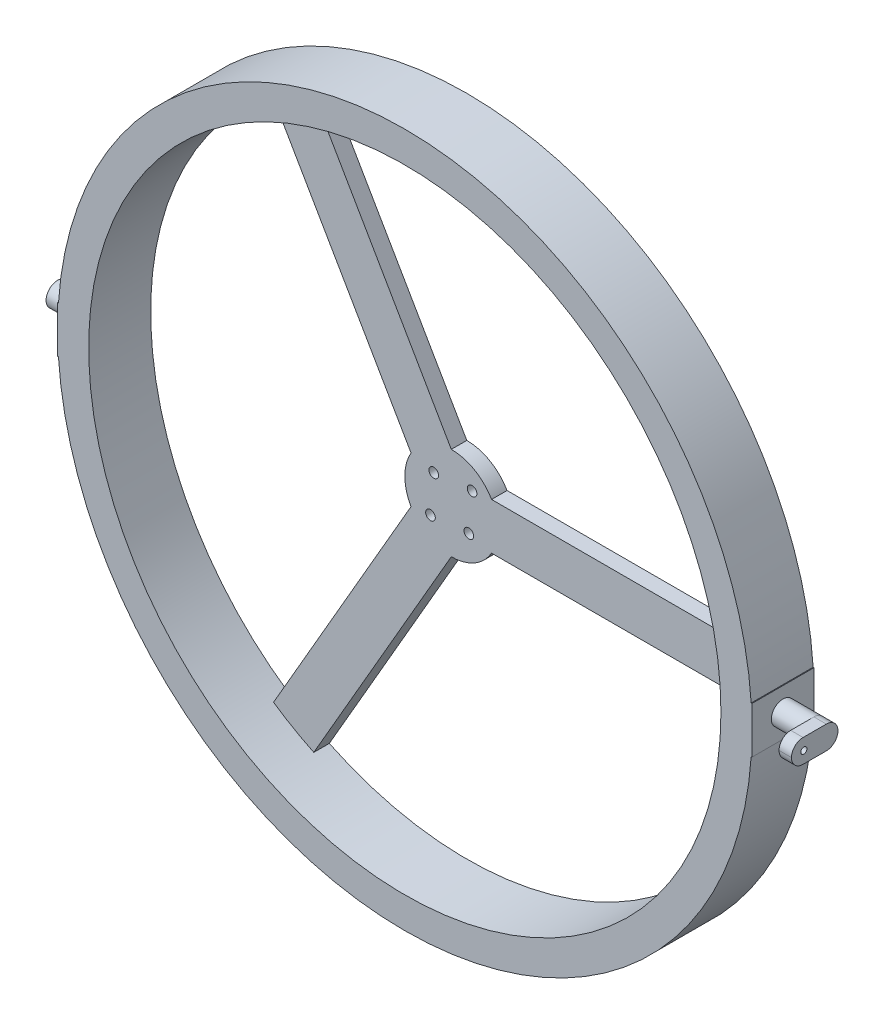
ISO-10303-21;
HEADER;
FILE_DESCRIPTION(('STEP AP214'),'2;1');
FILE_NAME('part.step','',(''),(''),'','','');
FILE_SCHEMA(('AUTOMOTIVE_DESIGN { 1 0 10303 214 1 1 1 1 }'));
ENDSEC;
DATA;
#1=APPLICATION_CONTEXT('core data for automotive mechanical design processes');
#2=APPLICATION_PROTOCOL_DEFINITION('international standard','automotive_design',2000,#1);
#3=PRODUCT_CONTEXT('',#1,'mechanical');
#4=PRODUCT('Part','Part','',(#3));
#5=PRODUCT_RELATED_PRODUCT_CATEGORY('part','',(#4));
#6=PRODUCT_DEFINITION_FORMATION('','',#4);
#7=PRODUCT_DEFINITION_CONTEXT('part definition',#1,'design');
#8=PRODUCT_DEFINITION('design','',#6,#7);
#9=PRODUCT_DEFINITION_SHAPE('','',#8);
#10=(LENGTH_UNIT() NAMED_UNIT(*) SI_UNIT(.MILLI.,.METRE.));
#11=(NAMED_UNIT(*) PLANE_ANGLE_UNIT() SI_UNIT($,.RADIAN.));
#12=(NAMED_UNIT(*) SI_UNIT($,.STERADIAN.) SOLID_ANGLE_UNIT());
#13=UNCERTAINTY_MEASURE_WITH_UNIT(LENGTH_MEASURE(1.E-05),#10,'distance_accuracy_value','');
#14=(GEOMETRIC_REPRESENTATION_CONTEXT(3) GLOBAL_UNCERTAINTY_ASSIGNED_CONTEXT((#13)) GLOBAL_UNIT_ASSIGNED_CONTEXT((#10,
#11,#12)) REPRESENTATION_CONTEXT('',''));
#15=CARTESIAN_POINT('',(0.,0.,0.));
#16=DIRECTION('',(0.,0.,1.));
#17=DIRECTION('',(1.,0.,0.));
#18=AXIS2_PLACEMENT_3D('',#15,#16,#17);
#19=CARTESIAN_POINT('',(112.,0.,20.));
#20=DIRECTION('',(1.,0.,0.));
#21=DIRECTION('',(0.,0.,-1.));
#22=AXIS2_PLACEMENT_3D('',#19,#20,#21);
#23=PLANE('',#22);
#24=DIRECTION('',(0.,-1.,0.));
#25=VECTOR('',#24,1.);
#26=CARTESIAN_POINT('',(112.,0.,0.));
#27=LINE('',#26,#25);
#28=CARTESIAN_POINT('',(112.,7.5,0.));
#29=VERTEX_POINT('',#28);
#30=CARTESIAN_POINT('',(112.,-7.5,0.));
#31=VERTEX_POINT('',#30);
#32=EDGE_CURVE('E391',#29,#31,#27,.T.);
#33=ORIENTED_EDGE('',*,*,#32,.F.);
#34=DIRECTION('',(0.,0.,-1.));
#35=VECTOR('',#34,1.);
#36=CARTESIAN_POINT('',(112.,7.5,20.));
#37=LINE('',#36,#35);
#38=CARTESIAN_POINT('',(112.,7.5,20.));
#39=VERTEX_POINT('',#38);
#40=EDGE_CURVE('E417',#39,#29,#37,.T.);
#41=ORIENTED_EDGE('',*,*,#40,.F.);
#42=DIRECTION('',(0.,-1.,0.));
#43=VECTOR('',#42,1.);
#44=CARTESIAN_POINT('',(112.,0.,20.));
#45=LINE('',#44,#43);
#46=CARTESIAN_POINT('',(112.,-7.5,20.));
#47=VERTEX_POINT('',#46);
#48=EDGE_CURVE('E367',#39,#47,#45,.T.);
#49=ORIENTED_EDGE('',*,*,#48,.T.);
#50=DIRECTION('',(0.,0.,-1.));
#51=VECTOR('',#50,1.);
#52=CARTESIAN_POINT('',(112.,-7.5,20.));
#53=LINE('',#52,#51);
#54=EDGE_CURVE('E419',#47,#31,#53,.T.);
#55=ORIENTED_EDGE('',*,*,#54,.T.);
#56=EDGE_LOOP('',(#33,#41,#49,#55));
#57=FACE_BOUND('',#56,.T.);
#58=CARTESIAN_POINT('',(112.,0.,10.));
#59=DIRECTION('',(1.,0.,0.));
#60=DIRECTION('',(0.,0.,-1.));
#61=AXIS2_PLACEMENT_3D('',#58,#59,#60);
#62=CIRCLE('',#61,3.75);
#63=CARTESIAN_POINT('',(112.,0.,6.25));
#64=VERTEX_POINT('',#63);
#65=EDGE_CURVE('E232',#64,#64,#62,.T.);
#66=ORIENTED_EDGE('',*,*,#65,.F.);
#67=EDGE_LOOP('',(#66));
#68=FACE_BOUND('',#67,.T.);
#69=ADVANCED_FACE('F37',(#57,#68),#23,.T.);
#70=CARTESIAN_POINT('',(-112.,0.,20.));
#71=DIRECTION('',(1.,0.,0.));
#72=DIRECTION('',(0.,0.,-1.));
#73=AXIS2_PLACEMENT_3D('',#70,#71,#72);
#74=PLANE('',#73);
#75=DIRECTION('',(0.,-1.,0.));
#76=VECTOR('',#75,1.);
#77=CARTESIAN_POINT('',(-112.,0.,0.));
#78=LINE('',#77,#76);
#79=CARTESIAN_POINT('',(-112.,7.5,0.));
#80=VERTEX_POINT('',#79);
#81=CARTESIAN_POINT('',(-112.,-7.50000000000001,0.));
#82=VERTEX_POINT('',#81);
#83=EDGE_CURVE('E401',#80,#82,#78,.T.);
#84=ORIENTED_EDGE('',*,*,#83,.T.);
#85=DIRECTION('',(0.,0.,-1.));
#86=VECTOR('',#85,1.);
#87=CARTESIAN_POINT('',(-112.,-7.50000000000001,20.));
#88=LINE('',#87,#86);
#89=CARTESIAN_POINT('',(-112.,-7.50000000000001,20.));
#90=VERTEX_POINT('',#89);
#91=EDGE_CURVE('E382',#90,#82,#88,.T.);
#92=ORIENTED_EDGE('',*,*,#91,.F.);
#93=DIRECTION('',(0.,-1.,0.));
#94=VECTOR('',#93,1.);
#95=CARTESIAN_POINT('',(-112.,0.,20.));
#96=LINE('',#95,#94);
#97=CARTESIAN_POINT('',(-112.,7.5,20.));
#98=VERTEX_POINT('',#97);
#99=EDGE_CURVE('E377',#98,#90,#96,.T.);
#100=ORIENTED_EDGE('',*,*,#99,.F.);
#101=DIRECTION('',(0.,0.,-1.));
#102=VECTOR('',#101,1.);
#103=CARTESIAN_POINT('',(-112.,7.5,20.));
#104=LINE('',#103,#102);
#105=EDGE_CURVE('E409',#98,#80,#104,.T.);
#106=ORIENTED_EDGE('',*,*,#105,.T.);
#107=EDGE_LOOP('',(#84,#92,#100,#106));
#108=FACE_BOUND('',#107,.T.);
#109=CARTESIAN_POINT('',(-112.,0.,10.));
#110=DIRECTION('',(1.,0.,0.));
#111=DIRECTION('',(0.,0.,-1.));
#112=AXIS2_PLACEMENT_3D('',#109,#110,#111);
#113=CIRCLE('',#112,3.75);
#114=CARTESIAN_POINT('',(-112.,0.,6.25));
#115=VERTEX_POINT('',#114);
#116=EDGE_CURVE('E426',#115,#115,#113,.F.);
#117=ORIENTED_EDGE('',*,*,#116,.F.);
#118=EDGE_LOOP('',(#117));
#119=FACE_BOUND('',#118,.T.);
#120=ADVANCED_FACE('F470',(#108,#119),#74,.F.);
#121=CARTESIAN_POINT('',(0.,0.,20.));
#122=DIRECTION('',(0.,0.,-1.));
#123=DIRECTION('',(-1.,0.,0.));
#124=AXIS2_PLACEMENT_3D('',#121,#122,#123);
#125=CYLINDRICAL_SURFACE('',#124,102.);
#126=DIRECTION('',(0.,0.,-1.));
#127=VECTOR('',#126,1.);
#128=CARTESIAN_POINT('',(-57.3571360279416,84.3454737770332,5.));
#129=LINE('',#128,#127);
#130=CARTESIAN_POINT('',(-57.3571360279416,84.3454737770332,5.));
#131=VERTEX_POINT('',#130);
#132=CARTESIAN_POINT('',(-57.3571360279416,84.3454737770332,0.));
#133=VERTEX_POINT('',#132);
#134=EDGE_CURVE('E310',#131,#133,#129,.T.);
#135=ORIENTED_EDGE('',*,*,#134,.F.);
#136=CARTESIAN_POINT('',(0.,0.,5.));
#137=DIRECTION('',(0.,0.,1.));
#138=DIRECTION('',(1.,0.,0.));
#139=AXIS2_PLACEMENT_3D('',#136,#137,#138);
#140=CIRCLE('',#139,102.);
#141=CARTESIAN_POINT('',(-44.3667549711751,91.8454737770333,5.));
#142=VERTEX_POINT('',#141);
#143=EDGE_CURVE('E308',#142,#131,#140,.T.);
#144=ORIENTED_EDGE('',*,*,#143,.F.);
#145=DIRECTION('',(0.,0.,-1.));
#146=VECTOR('',#145,1.);
#147=CARTESIAN_POINT('',(-44.3667549711751,91.8454737770333,5.));
#148=LINE('',#147,#146);
#149=CARTESIAN_POINT('',(-44.3667549711751,91.8454737770333,0.));
#150=VERTEX_POINT('',#149);
#151=EDGE_CURVE('E327',#142,#150,#148,.T.);
#152=ORIENTED_EDGE('',*,*,#151,.T.);
#153=CARTESIAN_POINT('',(0.,0.,0.));
#154=DIRECTION('',(0.,0.,1.));
#155=DIRECTION('',(1.,0.,0.));
#156=AXIS2_PLACEMENT_3D('',#153,#154,#155);
#157=CIRCLE('',#156,102.);
#158=CARTESIAN_POINT('',(101.723890999116,7.5,0.));
#159=VERTEX_POINT('',#158);
#160=EDGE_CURVE('E362',#159,#150,#157,.T.);
#161=ORIENTED_EDGE('',*,*,#160,.F.);
#162=DIRECTION('',(0.,0.,-1.));
#163=VECTOR('',#162,1.);
#164=CARTESIAN_POINT('',(101.723890999116,7.5,5.));
#165=LINE('',#164,#163);
#166=CARTESIAN_POINT('',(101.723890999116,7.5,5.));
#167=VERTEX_POINT('',#166);
#168=EDGE_CURVE('E335',#167,#159,#165,.T.);
#169=ORIENTED_EDGE('',*,*,#168,.F.);
#170=CARTESIAN_POINT('',(0.,0.,5.));
#171=DIRECTION('',(0.,0.,1.));
#172=DIRECTION('',(1.,0.,0.));
#173=AXIS2_PLACEMENT_3D('',#170,#171,#172);
#174=CIRCLE('',#173,102.);
#175=CARTESIAN_POINT('',(101.723890999116,-7.5,5.));
#176=VERTEX_POINT('',#175);
#177=EDGE_CURVE('E301',#176,#167,#174,.T.);
#178=ORIENTED_EDGE('',*,*,#177,.F.);
#179=DIRECTION('',(0.,0.,-1.));
#180=VECTOR('',#179,1.);
#181=CARTESIAN_POINT('',(101.723890999116,-7.5,5.));
#182=LINE('',#181,#180);
#183=CARTESIAN_POINT('',(101.723890999116,-7.5,0.));
#184=VERTEX_POINT('',#183);
#185=EDGE_CURVE('E338',#176,#184,#182,.T.);
#186=ORIENTED_EDGE('',*,*,#185,.T.);
#187=CARTESIAN_POINT('',(-44.3667549711737,-91.845473777034,0.));
#188=VERTEX_POINT('',#187);
#189=EDGE_CURVE('E403',#188,#184,#157,.T.);
#190=ORIENTED_EDGE('',*,*,#189,.F.);
#191=DIRECTION('',(0.,0.,-1.));
#192=VECTOR('',#191,1.);
#193=CARTESIAN_POINT('',(-44.3667549711737,-91.8454737770339,5.));
#194=LINE('',#193,#192);
#195=CARTESIAN_POINT('',(-44.3667549711737,-91.8454737770339,5.));
#196=VERTEX_POINT('',#195);
#197=EDGE_CURVE('E346',#196,#188,#194,.T.);
#198=ORIENTED_EDGE('',*,*,#197,.F.);
#199=CARTESIAN_POINT('',(0.,0.,5.));
#200=DIRECTION('',(0.,0.,1.));
#201=DIRECTION('',(1.,0.,0.));
#202=AXIS2_PLACEMENT_3D('',#199,#200,#201);
#203=CIRCLE('',#202,102.);
#204=CARTESIAN_POINT('',(-57.3571360279404,-84.3454737770341,5.));
#205=VERTEX_POINT('',#204);
#206=EDGE_CURVE('E294',#205,#196,#203,.T.);
#207=ORIENTED_EDGE('',*,*,#206,.F.);
#208=DIRECTION('',(0.,0.,-1.));
#209=VECTOR('',#208,1.);
#210=CARTESIAN_POINT('',(-57.3571360279404,-84.3454737770341,5.));
#211=LINE('',#210,#209);
#212=CARTESIAN_POINT('',(-57.3571360279404,-84.3454737770341,0.));
#213=VERTEX_POINT('',#212);
#214=EDGE_CURVE('E349',#205,#213,#211,.T.);
#215=ORIENTED_EDGE('',*,*,#214,.T.);
#216=EDGE_CURVE('E406',#133,#213,#157,.T.);
#217=ORIENTED_EDGE('',*,*,#216,.F.);
#218=EDGE_LOOP('',(#135,#144,#152,#161,#169,#178,#186,#190,#198,#207,#215,#217));
#219=FACE_BOUND('',#218,.T.);
#220=CARTESIAN_POINT('',(0.,0.,20.));
#221=DIRECTION('',(0.,0.,1.));
#222=DIRECTION('',(1.,0.,0.));
#223=AXIS2_PLACEMENT_3D('',#220,#221,#222);
#224=CIRCLE('',#223,102.);
#225=CARTESIAN_POINT('',(102.,0.,20.));
#226=VERTEX_POINT('',#225);
#227=EDGE_CURVE('E379',#226,#226,#224,.T.);
#228=ORIENTED_EDGE('',*,*,#227,.T.);
#229=EDGE_LOOP('',(#228));
#230=FACE_BOUND('',#229,.T.);
#231=ADVANCED_FACE('F476',(#219,#230),#125,.F.);
#232=CARTESIAN_POINT('',(3.10513561780925E-13,-7.49999999999538,20.));
#233=DIRECTION('',(0.,1.,0.));
#234=DIRECTION('',(-1.,0.,0.));
#235=AXIS2_PLACEMENT_3D('',#232,#233,#234);
#236=PLANE('',#235);
#237=DIRECTION('',(1.,0.,0.));
#238=VECTOR('',#237,1.);
#239=CARTESIAN_POINT('',(3.10513561780925E-13,-7.49999999999538,0.));
#240=LINE('',#239,#238);
#241=CARTESIAN_POINT('',(-111.748601780962,-7.5,0.));
#242=VERTEX_POINT('',#241);
#243=EDGE_CURVE('E357',#82,#242,#240,.T.);
#244=ORIENTED_EDGE('',*,*,#243,.T.);
#245=DIRECTION('',(0.,0.,-1.));
#246=VECTOR('',#245,1.);
#247=CARTESIAN_POINT('',(-111.748601780962,-7.5,20.));
#248=LINE('',#247,#246);
#249=CARTESIAN_POINT('',(-111.748601780962,-7.5,20.));
#250=VERTEX_POINT('',#249);
#251=EDGE_CURVE('E423',#250,#242,#248,.T.);
#252=ORIENTED_EDGE('',*,*,#251,.F.);
#253=DIRECTION('',(1.,0.,0.));
#254=VECTOR('',#253,1.);
#255=CARTESIAN_POINT('',(3.10513561780925E-13,-7.49999999999538,20.));
#256=LINE('',#255,#254);
#257=EDGE_CURVE('E358',#90,#250,#256,.T.);
#258=ORIENTED_EDGE('',*,*,#257,.F.);
#259=ORIENTED_EDGE('',*,*,#91,.T.);
#260=EDGE_LOOP('',(#244,#252,#258,#259));
#261=FACE_BOUND('',#260,.T.);
#262=ADVANCED_FACE('F492',(#261),#236,.F.);
#263=CARTESIAN_POINT('',(0.,0.,20.));
#264=DIRECTION('',(0.,0.,-1.));
#265=DIRECTION('',(-1.,0.,0.));
#266=AXIS2_PLACEMENT_3D('',#263,#264,#265);
#267=CYLINDRICAL_SURFACE('',#266,112.);
#268=CARTESIAN_POINT('',(0.,0.,0.));
#269=DIRECTION('',(0.,0.,1.));
#270=DIRECTION('',(1.,0.,0.));
#271=AXIS2_PLACEMENT_3D('',#268,#269,#270);
#272=CIRCLE('',#271,112.);
#273=CARTESIAN_POINT('',(111.748601780962,-7.5,0.));
#274=VERTEX_POINT('',#273);
#275=EDGE_CURVE('E385',#242,#274,#272,.T.);
#276=ORIENTED_EDGE('',*,*,#275,.T.);
#277=DIRECTION('',(0.,0.,-1.));
#278=VECTOR('',#277,1.);
#279=CARTESIAN_POINT('',(111.748601780962,-7.5,20.));
#280=LINE('',#279,#278);
#281=CARTESIAN_POINT('',(111.748601780962,-7.5,20.));
#282=VERTEX_POINT('',#281);
#283=EDGE_CURVE('E421',#282,#274,#280,.T.);
#284=ORIENTED_EDGE('',*,*,#283,.F.);
#285=CARTESIAN_POINT('',(0.,0.,20.));
#286=DIRECTION('',(0.,0.,1.));
#287=DIRECTION('',(1.,0.,0.));
#288=AXIS2_PLACEMENT_3D('',#285,#286,#287);
#289=CIRCLE('',#288,112.);
#290=EDGE_CURVE('E361',#250,#282,#289,.T.);
#291=ORIENTED_EDGE('',*,*,#290,.F.);
#292=ORIENTED_EDGE('',*,*,#251,.T.);
#293=EDGE_LOOP('',(#276,#284,#291,#292));
#294=FACE_BOUND('',#293,.T.);
#295=ADVANCED_FACE('F488',(#294),#267,.T.);
#296=CARTESIAN_POINT('',(0.,-7.49999999999961,20.));
#297=DIRECTION('',(0.,-1.,0.));
#298=DIRECTION('',(1.,0.,0.));
#299=AXIS2_PLACEMENT_3D('',#296,#297,#298);
#300=PLANE('',#299);
#301=DIRECTION('',(-1.,0.,0.));
#302=VECTOR('',#301,1.);
#303=CARTESIAN_POINT('',(0.,-7.49999999999961,0.));
#304=LINE('',#303,#302);
#305=EDGE_CURVE('E388',#31,#274,#304,.T.);
#306=ORIENTED_EDGE('',*,*,#305,.F.);
#307=ORIENTED_EDGE('',*,*,#54,.F.);
#308=DIRECTION('',(-1.,0.,0.));
#309=VECTOR('',#308,1.);
#310=CARTESIAN_POINT('',(0.,-7.49999999999961,20.));
#311=LINE('',#310,#309);
#312=EDGE_CURVE('E364',#47,#282,#311,.T.);
#313=ORIENTED_EDGE('',*,*,#312,.T.);
#314=ORIENTED_EDGE('',*,*,#283,.T.);
#315=EDGE_LOOP('',(#306,#307,#313,#314));
#316=FACE_BOUND('',#315,.T.);
#317=ADVANCED_FACE('F485',(#316),#300,.T.);
#318=CARTESIAN_POINT('',(0.,7.5,20.));
#319=DIRECTION('',(0.,1.,0.));
#320=DIRECTION('',(0.,0.,1.));
#321=AXIS2_PLACEMENT_3D('',#318,#319,#320);
#322=PLANE('',#321);
#323=DIRECTION('',(1.,0.,0.));
#324=VECTOR('',#323,1.);
#325=CARTESIAN_POINT('',(0.,7.5,0.));
#326=LINE('',#325,#324);
#327=CARTESIAN_POINT('',(111.748601780962,7.5,0.));
#328=VERTEX_POINT('',#327);
#329=EDGE_CURVE('E394',#328,#29,#326,.T.);
#330=ORIENTED_EDGE('',*,*,#329,.F.);
#331=DIRECTION('',(0.,0.,-1.));
#332=VECTOR('',#331,1.);
#333=CARTESIAN_POINT('',(111.748601780962,7.5,20.));
#334=LINE('',#333,#332);
#335=CARTESIAN_POINT('',(111.748601780962,7.5,20.));
#336=VERTEX_POINT('',#335);
#337=EDGE_CURVE('E415',#336,#328,#334,.T.);
#338=ORIENTED_EDGE('',*,*,#337,.F.);
#339=DIRECTION('',(1.,0.,0.));
#340=VECTOR('',#339,1.);
#341=CARTESIAN_POINT('',(0.,7.5,20.));
#342=LINE('',#341,#340);
#343=EDGE_CURVE('E370',#336,#39,#342,.T.);
#344=ORIENTED_EDGE('',*,*,#343,.T.);
#345=ORIENTED_EDGE('',*,*,#40,.T.);
#346=EDGE_LOOP('',(#330,#338,#344,#345));
#347=FACE_BOUND('',#346,.T.);
#348=ADVANCED_FACE('F483',(#347),#322,.T.);
#349=CARTESIAN_POINT('',(0.,0.,20.));
#350=DIRECTION('',(0.,0.,-1.));
#351=DIRECTION('',(-1.,0.,0.));
#352=AXIS2_PLACEMENT_3D('',#349,#350,#351);
#353=CYLINDRICAL_SURFACE('',#352,112.);
#354=CARTESIAN_POINT('',(0.,0.,0.));
#355=DIRECTION('',(0.,0.,1.));
#356=DIRECTION('',(1.,0.,0.));
#357=AXIS2_PLACEMENT_3D('',#354,#355,#356);
#358=CIRCLE('',#357,112.);
#359=CARTESIAN_POINT('',(-111.748601780962,7.5,0.));
#360=VERTEX_POINT('',#359);
#361=EDGE_CURVE('E397',#328,#360,#358,.T.);
#362=ORIENTED_EDGE('',*,*,#361,.T.);
#363=DIRECTION('',(0.,0.,-1.));
#364=VECTOR('',#363,1.);
#365=CARTESIAN_POINT('',(-111.748601780962,7.5,20.));
#366=LINE('',#365,#364);
#367=CARTESIAN_POINT('',(-111.748601780962,7.5,20.));
#368=VERTEX_POINT('',#367);
#369=EDGE_CURVE('E412',#368,#360,#366,.T.);
#370=ORIENTED_EDGE('',*,*,#369,.F.);
#371=CARTESIAN_POINT('',(0.,0.,20.));
#372=DIRECTION('',(0.,0.,1.));
#373=DIRECTION('',(1.,0.,0.));
#374=AXIS2_PLACEMENT_3D('',#371,#372,#373);
#375=CIRCLE('',#374,112.);
#376=EDGE_CURVE('E373',#336,#368,#375,.T.);
#377=ORIENTED_EDGE('',*,*,#376,.F.);
#378=ORIENTED_EDGE('',*,*,#337,.T.);
#379=EDGE_LOOP('',(#362,#370,#377,#378));
#380=FACE_BOUND('',#379,.T.);
#381=ADVANCED_FACE('F752',(#380),#353,.T.);
#382=CARTESIAN_POINT('',(0.,7.5,20.));
#383=DIRECTION('',(0.,-1.,0.));
#384=DIRECTION('',(0.,0.,-1.));
#385=AXIS2_PLACEMENT_3D('',#382,#383,#384);
#386=PLANE('',#385);
#387=DIRECTION('',(-1.,0.,0.));
#388=VECTOR('',#387,1.);
#389=CARTESIAN_POINT('',(0.,7.5,0.));
#390=LINE('',#389,#388);
#391=EDGE_CURVE('E399',#360,#80,#390,.T.);
#392=ORIENTED_EDGE('',*,*,#391,.T.);
#393=ORIENTED_EDGE('',*,*,#105,.F.);
#394=DIRECTION('',(-1.,0.,0.));
#395=VECTOR('',#394,1.);
#396=CARTESIAN_POINT('',(0.,7.5,20.));
#397=LINE('',#396,#395);
#398=EDGE_CURVE('E375',#368,#98,#397,.T.);
#399=ORIENTED_EDGE('',*,*,#398,.F.);
#400=ORIENTED_EDGE('',*,*,#369,.T.);
#401=EDGE_LOOP('',(#392,#393,#399,#400));
#402=FACE_BOUND('',#401,.T.);
#403=ADVANCED_FACE('F742',(#402),#386,.F.);
#404=CARTESIAN_POINT('',(0.,0.,20.));
#405=DIRECTION('',(0.,0.,1.));
#406=DIRECTION('',(1.,0.,0.));
#407=AXIS2_PLACEMENT_3D('',#404,#405,#406);
#408=PLANE('',#407);
#409=ORIENTED_EDGE('',*,*,#257,.T.);
#410=ORIENTED_EDGE('',*,*,#290,.T.);
#411=ORIENTED_EDGE('',*,*,#312,.F.);
#412=ORIENTED_EDGE('',*,*,#48,.F.);
#413=ORIENTED_EDGE('',*,*,#343,.F.);
#414=ORIENTED_EDGE('',*,*,#376,.T.);
#415=ORIENTED_EDGE('',*,*,#398,.T.);
#416=ORIENTED_EDGE('',*,*,#99,.T.);
#417=EDGE_LOOP('',(#409,#410,#411,#412,#413,#414,#415,#416));
#418=FACE_BOUND('',#417,.T.);
#419=ORIENTED_EDGE('',*,*,#227,.F.);
#420=EDGE_LOOP('',(#419));
#421=FACE_BOUND('',#420,.T.);
#422=ADVANCED_FACE('F635',(#418,#421),#408,.T.);
#423=CARTESIAN_POINT('',(0.,0.,0.));
#424=DIRECTION('',(0.,0.,1.));
#425=DIRECTION('',(1.,0.,0.));
#426=AXIS2_PLACEMENT_3D('',#423,#424,#425);
#427=PLANE('',#426);
#428=CARTESIAN_POINT('',(-6.7175144212722,-6.7175144212722,0.));
#429=DIRECTION('',(0.,0.,1.));
#430=DIRECTION('',(1.,0.,0.));
#431=AXIS2_PLACEMENT_3D('',#428,#429,#430);
#432=CIRCLE('',#431,1.55);
#433=CARTESIAN_POINT('',(-5.1675144212722,-6.7175144212722,0.));
#434=VERTEX_POINT('',#433);
#435=EDGE_CURVE('E260',#434,#434,#432,.T.);
#436=ORIENTED_EDGE('',*,*,#435,.T.);
#437=EDGE_LOOP('',(#436));
#438=FACE_BOUND('',#437,.T.);
#439=CARTESIAN_POINT('',(5.65685424949238,-5.65685424949238,0.));
#440=DIRECTION('',(0.,0.,1.));
#441=DIRECTION('',(1.,0.,0.));
#442=AXIS2_PLACEMENT_3D('',#439,#440,#441);
#443=CIRCLE('',#442,1.55);
#444=CARTESIAN_POINT('',(7.20685424949238,-5.65685424949238,0.));
#445=VERTEX_POINT('',#444);
#446=EDGE_CURVE('E266',#445,#445,#443,.T.);
#447=ORIENTED_EDGE('',*,*,#446,.T.);
#448=EDGE_LOOP('',(#447));
#449=FACE_BOUND('',#448,.T.);
#450=CARTESIAN_POINT('',(6.7175144212722,6.7175144212722,0.));
#451=DIRECTION('',(0.,0.,1.));
#452=DIRECTION('',(1.,0.,0.));
#453=AXIS2_PLACEMENT_3D('',#450,#451,#452);
#454=CIRCLE('',#453,1.55);
#455=CARTESIAN_POINT('',(8.2675144212722,6.7175144212722,0.));
#456=VERTEX_POINT('',#455);
#457=EDGE_CURVE('E272',#456,#456,#454,.T.);
#458=ORIENTED_EDGE('',*,*,#457,.T.);
#459=EDGE_LOOP('',(#458));
#460=FACE_BOUND('',#459,.T.);
#461=CARTESIAN_POINT('',(-5.65685424949238,5.65685424949238,0.));
#462=DIRECTION('',(0.,0.,1.));
#463=DIRECTION('',(1.,0.,0.));
#464=AXIS2_PLACEMENT_3D('',#461,#462,#463);
#465=CIRCLE('',#464,1.55);
#466=CARTESIAN_POINT('',(-4.10685424949238,5.65685424949238,0.));
#467=VERTEX_POINT('',#466);
#468=EDGE_CURVE('E278',#467,#467,#465,.T.);
#469=ORIENTED_EDGE('',*,*,#468,.T.);
#470=EDGE_LOOP('',(#469));
#471=FACE_BOUND('',#470,.T.);
#472=DIRECTION('',(-0.499999999999992,-0.866025403784444,0.));
#473=VECTOR('',#472,1.);
#474=CARTESIAN_POINT('',(6.49519052838333,-3.74999999999994,0.));
#475=LINE('',#474,#473);
#476=CARTESIAN_POINT('',(1.4658413372004E-13,-15.,0.));
#477=VERTEX_POINT('',#476);
#478=EDGE_CURVE('E318',#477,#188,#475,.T.);
#479=ORIENTED_EDGE('',*,*,#478,.T.);
#480=ORIENTED_EDGE('',*,*,#189,.T.);
#481=DIRECTION('',(1.,0.,0.));
#482=VECTOR('',#481,1.);
#483=CARTESIAN_POINT('',(0.,-7.5,0.));
#484=LINE('',#483,#482);
#485=CARTESIAN_POINT('',(12.9903810567666,-7.5,0.));
#486=VERTEX_POINT('',#485);
#487=EDGE_CURVE('E320',#486,#184,#484,.T.);
#488=ORIENTED_EDGE('',*,*,#487,.F.);
#489=CARTESIAN_POINT('',(0.,0.,0.));
#490=DIRECTION('',(0.,0.,1.));
#491=DIRECTION('',(1.,0.,0.));
#492=AXIS2_PLACEMENT_3D('',#489,#490,#491);
#493=CIRCLE('',#492,15.);
#494=EDGE_CURVE('E316',#477,#486,#493,.T.);
#495=ORIENTED_EDGE('',*,*,#494,.F.);
#496=EDGE_LOOP('',(#479,#480,#488,#495));
#497=FACE_BOUND('',#496,.T.);
#498=DIRECTION('',(1.,0.,0.));
#499=VECTOR('',#498,1.);
#500=CARTESIAN_POINT('',(0.,7.5,0.));
#501=LINE('',#500,#499);
#502=CARTESIAN_POINT('',(12.9903810567666,7.5,0.));
#503=VERTEX_POINT('',#502);
#504=EDGE_CURVE('E322',#503,#159,#501,.T.);
#505=ORIENTED_EDGE('',*,*,#504,.T.);
#506=ORIENTED_EDGE('',*,*,#160,.T.);
#507=DIRECTION('',(-0.500000000000004,0.866025403784436,0.));
#508=VECTOR('',#507,1.);
#509=CARTESIAN_POINT('',(6.49519052838327,3.75000000000003,0.));
#510=LINE('',#509,#508);
#511=CARTESIAN_POINT('',(0.,15.,0.));
#512=VERTEX_POINT('',#511);
#513=EDGE_CURVE('E288',#512,#150,#510,.T.);
#514=ORIENTED_EDGE('',*,*,#513,.F.);
#515=EDGE_CURVE('E315',#503,#512,#493,.T.);
#516=ORIENTED_EDGE('',*,*,#515,.F.);
#517=EDGE_LOOP('',(#505,#506,#514,#516));
#518=FACE_BOUND('',#517,.T.);
#519=ORIENTED_EDGE('',*,*,#243,.F.);
#520=ORIENTED_EDGE('',*,*,#83,.F.);
#521=ORIENTED_EDGE('',*,*,#391,.F.);
#522=ORIENTED_EDGE('',*,*,#361,.F.);
#523=ORIENTED_EDGE('',*,*,#329,.T.);
#524=ORIENTED_EDGE('',*,*,#32,.T.);
#525=ORIENTED_EDGE('',*,*,#305,.T.);
#526=ORIENTED_EDGE('',*,*,#275,.F.);
#527=EDGE_LOOP('',(#519,#520,#521,#522,#523,#524,#525,#526));
#528=FACE_BOUND('',#527,.T.);
#529=ORIENTED_EDGE('',*,*,#216,.T.);
#530=DIRECTION('',(-0.499999999999991,-0.866025403784444,0.));
#531=VECTOR('',#530,1.);
#532=CARTESIAN_POINT('',(-6.49519052838333,3.74999999999994,0.));
#533=LINE('',#532,#531);
#534=CARTESIAN_POINT('',(-12.9903810567665,-7.50000000000013,0.));
#535=VERTEX_POINT('',#534);
#536=EDGE_CURVE('E314',#535,#213,#533,.T.);
#537=ORIENTED_EDGE('',*,*,#536,.F.);
#538=CARTESIAN_POINT('',(-12.9903810567666,7.49999999999994,0.));
#539=VERTEX_POINT('',#538);
#540=EDGE_CURVE('E312',#539,#535,#493,.T.);
#541=ORIENTED_EDGE('',*,*,#540,.F.);
#542=DIRECTION('',(-0.500000000000004,0.866025403784436,0.));
#543=VECTOR('',#542,1.);
#544=CARTESIAN_POINT('',(-6.49519052838327,-3.75000000000003,0.));
#545=LINE('',#544,#543);
#546=EDGE_CURVE('E281',#539,#133,#545,.T.);
#547=ORIENTED_EDGE('',*,*,#546,.T.);
#548=EDGE_LOOP('',(#529,#537,#541,#547));
#549=FACE_BOUND('',#548,.T.);
#550=ADVANCED_FACE('F629',(#438,#449,#460,#471,#497,#518,#528,#549),#427,.F.);
#551=CARTESIAN_POINT('',(-6.49519052838327,-3.75000000000003,5.));
#552=DIRECTION('',(-0.866025403784436,-0.500000000000004,0.));
#553=DIRECTION('',(0.500000000000004,-0.866025403784436,0.));
#554=AXIS2_PLACEMENT_3D('',#551,#552,#553);
#555=PLANE('',#554);
#556=ORIENTED_EDGE('',*,*,#546,.F.);
#557=DIRECTION('',(0.,0.,-1.));
#558=VECTOR('',#557,1.);
#559=CARTESIAN_POINT('',(-12.9903810567666,7.49999999999994,5.));
#560=LINE('',#559,#558);
#561=CARTESIAN_POINT('',(-12.9903810567666,7.49999999999994,5.));
#562=VERTEX_POINT('',#561);
#563=EDGE_CURVE('E355',#562,#539,#560,.T.);
#564=ORIENTED_EDGE('',*,*,#563,.F.);
#565=DIRECTION('',(-0.500000000000004,0.866025403784436,0.));
#566=VECTOR('',#565,1.);
#567=CARTESIAN_POINT('',(-6.49519052838327,-3.75000000000003,5.));
#568=LINE('',#567,#566);
#569=EDGE_CURVE('E284',#562,#131,#568,.T.);
#570=ORIENTED_EDGE('',*,*,#569,.T.);
#571=ORIENTED_EDGE('',*,*,#134,.T.);
#572=EDGE_LOOP('',(#556,#564,#570,#571));
#573=FACE_BOUND('',#572,.T.);
#574=ADVANCED_FACE('F634',(#573),#555,.T.);
#575=CARTESIAN_POINT('',(0.,0.,5.));
#576=DIRECTION('',(0.,0.,-1.));
#577=DIRECTION('',(-1.,0.,0.));
#578=AXIS2_PLACEMENT_3D('',#575,#576,#577);
#579=CYLINDRICAL_SURFACE('',#578,15.);
#580=ORIENTED_EDGE('',*,*,#540,.T.);
#581=DIRECTION('',(0.,0.,-1.));
#582=VECTOR('',#581,1.);
#583=CARTESIAN_POINT('',(-12.9903810567665,-7.50000000000013,5.));
#584=LINE('',#583,#582);
#585=CARTESIAN_POINT('',(-12.9903810567665,-7.50000000000013,5.));
#586=VERTEX_POINT('',#585);
#587=EDGE_CURVE('E352',#586,#535,#584,.T.);
#588=ORIENTED_EDGE('',*,*,#587,.F.);
#589=CARTESIAN_POINT('',(0.,0.,5.));
#590=DIRECTION('',(0.,0.,1.));
#591=DIRECTION('',(1.,0.,0.));
#592=AXIS2_PLACEMENT_3D('',#589,#590,#591);
#593=CIRCLE('',#592,15.);
#594=EDGE_CURVE('E287',#562,#586,#593,.T.);
#595=ORIENTED_EDGE('',*,*,#594,.F.);
#596=ORIENTED_EDGE('',*,*,#563,.T.);
#597=EDGE_LOOP('',(#580,#588,#595,#596));
#598=FACE_BOUND('',#597,.T.);
#599=ADVANCED_FACE('F662',(#598),#579,.T.);
#600=CARTESIAN_POINT('',(-6.49519052838333,3.74999999999994,5.));
#601=DIRECTION('',(0.866025403784444,-0.499999999999991,0.));
#602=DIRECTION('',(0.499999999999991,0.866025403784444,0.));
#603=AXIS2_PLACEMENT_3D('',#600,#601,#602);
#604=PLANE('',#603);
#605=ORIENTED_EDGE('',*,*,#536,.T.);
#606=ORIENTED_EDGE('',*,*,#214,.F.);
#607=DIRECTION('',(-0.499999999999991,-0.866025403784444,0.));
#608=VECTOR('',#607,1.);
#609=CARTESIAN_POINT('',(-6.49519052838333,3.74999999999994,5.));
#610=LINE('',#609,#608);
#611=EDGE_CURVE('E290',#586,#205,#610,.T.);
#612=ORIENTED_EDGE('',*,*,#611,.F.);
#613=ORIENTED_EDGE('',*,*,#587,.T.);
#614=EDGE_LOOP('',(#605,#606,#612,#613));
#615=FACE_BOUND('',#614,.T.);
#616=ADVANCED_FACE('F699',(#615),#604,.F.);
#617=CARTESIAN_POINT('',(6.49519052838333,-3.74999999999994,5.));
#618=DIRECTION('',(0.866025403784444,-0.499999999999992,0.));
#619=DIRECTION('',(0.499999999999992,0.866025403784444,0.));
#620=AXIS2_PLACEMENT_3D('',#617,#618,#619);
#621=PLANE('',#620);
#622=ORIENTED_EDGE('',*,*,#478,.F.);
#623=DIRECTION('',(0.,0.,-1.));
#624=VECTOR('',#623,1.);
#625=CARTESIAN_POINT('',(1.4658413372004E-13,-15.,5.));
#626=LINE('',#625,#624);
#627=CARTESIAN_POINT('',(1.4658413372004E-13,-15.,5.));
#628=VERTEX_POINT('',#627);
#629=EDGE_CURVE('E344',#628,#477,#626,.T.);
#630=ORIENTED_EDGE('',*,*,#629,.F.);
#631=DIRECTION('',(-0.499999999999992,-0.866025403784444,0.));
#632=VECTOR('',#631,1.);
#633=CARTESIAN_POINT('',(6.49519052838333,-3.74999999999994,5.));
#634=LINE('',#633,#632);
#635=EDGE_CURVE('E296',#628,#196,#634,.T.);
#636=ORIENTED_EDGE('',*,*,#635,.T.);
#637=ORIENTED_EDGE('',*,*,#197,.T.);
#638=EDGE_LOOP('',(#622,#630,#636,#637));
#639=FACE_BOUND('',#638,.T.);
#640=ADVANCED_FACE('F690',(#639),#621,.T.);
#641=ORIENTED_EDGE('',*,*,#494,.T.);
#642=DIRECTION('',(0.,0.,-1.));
#643=VECTOR('',#642,1.);
#644=CARTESIAN_POINT('',(12.9903810567666,-7.5,5.));
#645=LINE('',#644,#643);
#646=CARTESIAN_POINT('',(12.9903810567666,-7.5,5.));
#647=VERTEX_POINT('',#646);
#648=EDGE_CURVE('E341',#647,#486,#645,.T.);
#649=ORIENTED_EDGE('',*,*,#648,.F.);
#650=EDGE_CURVE('E292',#628,#647,#593,.T.);
#651=ORIENTED_EDGE('',*,*,#650,.F.);
#652=ORIENTED_EDGE('',*,*,#629,.T.);
#653=EDGE_LOOP('',(#641,#649,#651,#652));
#654=FACE_BOUND('',#653,.T.);
#655=ADVANCED_FACE('F663',(#654),#579,.T.);
#656=CARTESIAN_POINT('',(0.,-7.5,5.));
#657=DIRECTION('',(0.,1.,0.));
#658=DIRECTION('',(0.,0.,1.));
#659=AXIS2_PLACEMENT_3D('',#656,#657,#658);
#660=PLANE('',#659);
#661=ORIENTED_EDGE('',*,*,#487,.T.);
#662=ORIENTED_EDGE('',*,*,#185,.F.);
#663=DIRECTION('',(1.,0.,0.));
#664=VECTOR('',#663,1.);
#665=CARTESIAN_POINT('',(0.,-7.5,5.));
#666=LINE('',#665,#664);
#667=EDGE_CURVE('E299',#647,#176,#666,.T.);
#668=ORIENTED_EDGE('',*,*,#667,.F.);
#669=ORIENTED_EDGE('',*,*,#648,.T.);
#670=EDGE_LOOP('',(#661,#662,#668,#669));
#671=FACE_BOUND('',#670,.T.);
#672=ADVANCED_FACE('F671',(#671),#660,.F.);
#673=CARTESIAN_POINT('',(0.,7.5,5.));
#674=DIRECTION('',(0.,1.,0.));
#675=DIRECTION('',(0.,0.,1.));
#676=AXIS2_PLACEMENT_3D('',#673,#674,#675);
#677=PLANE('',#676);
#678=ORIENTED_EDGE('',*,*,#504,.F.);
#679=DIRECTION('',(0.,0.,-1.));
#680=VECTOR('',#679,1.);
#681=CARTESIAN_POINT('',(12.9903810567666,7.5,5.));
#682=LINE('',#681,#680);
#683=CARTESIAN_POINT('',(12.9903810567666,7.5,5.));
#684=VERTEX_POINT('',#683);
#685=EDGE_CURVE('E333',#684,#503,#682,.T.);
#686=ORIENTED_EDGE('',*,*,#685,.F.);
#687=DIRECTION('',(1.,0.,0.));
#688=VECTOR('',#687,1.);
#689=CARTESIAN_POINT('',(0.,7.5,5.));
#690=LINE('',#689,#688);
#691=EDGE_CURVE('E303',#684,#167,#690,.T.);
#692=ORIENTED_EDGE('',*,*,#691,.T.);
#693=ORIENTED_EDGE('',*,*,#168,.T.);
#694=EDGE_LOOP('',(#678,#686,#692,#693));
#695=FACE_BOUND('',#694,.T.);
#696=ADVANCED_FACE('F659',(#695),#677,.T.);
#697=ORIENTED_EDGE('',*,*,#515,.T.);
#698=DIRECTION('',(0.,0.,-1.));
#699=VECTOR('',#698,1.);
#700=CARTESIAN_POINT('',(0.,15.,5.));
#701=LINE('',#700,#699);
#702=CARTESIAN_POINT('',(0.,15.,5.));
#703=VERTEX_POINT('',#702);
#704=EDGE_CURVE('E330',#703,#512,#701,.T.);
#705=ORIENTED_EDGE('',*,*,#704,.F.);
#706=EDGE_CURVE('E291',#684,#703,#593,.T.);
#707=ORIENTED_EDGE('',*,*,#706,.F.);
#708=ORIENTED_EDGE('',*,*,#685,.T.);
#709=EDGE_LOOP('',(#697,#705,#707,#708));
#710=FACE_BOUND('',#709,.T.);
#711=ADVANCED_FACE('F648',(#710),#579,.T.);
#712=CARTESIAN_POINT('',(6.49519052838327,3.75000000000003,5.));
#713=DIRECTION('',(-0.866025403784436,-0.500000000000004,0.));
#714=DIRECTION('',(0.500000000000004,-0.866025403784436,0.));
#715=AXIS2_PLACEMENT_3D('',#712,#713,#714);
#716=PLANE('',#715);
#717=ORIENTED_EDGE('',*,*,#513,.T.);
#718=ORIENTED_EDGE('',*,*,#151,.F.);
#719=DIRECTION('',(-0.500000000000004,0.866025403784436,0.));
#720=VECTOR('',#719,1.);
#721=CARTESIAN_POINT('',(6.49519052838327,3.75000000000003,5.));
#722=LINE('',#721,#720);
#723=EDGE_CURVE('E306',#703,#142,#722,.T.);
#724=ORIENTED_EDGE('',*,*,#723,.F.);
#725=ORIENTED_EDGE('',*,*,#704,.T.);
#726=EDGE_LOOP('',(#717,#718,#724,#725));
#727=FACE_BOUND('',#726,.T.);
#728=ADVANCED_FACE('F621',(#727),#716,.F.);
#729=CARTESIAN_POINT('',(0.,0.,5.));
#730=DIRECTION('',(0.,0.,1.));
#731=DIRECTION('',(1.,0.,0.));
#732=AXIS2_PLACEMENT_3D('',#729,#730,#731);
#733=PLANE('',#732);
#734=CARTESIAN_POINT('',(-6.7175144212722,-6.7175144212722,5.));
#735=DIRECTION('',(0.,0.,1.));
#736=DIRECTION('',(1.,0.,0.));
#737=AXIS2_PLACEMENT_3D('',#734,#735,#736);
#738=CIRCLE('',#737,1.55);
#739=CARTESIAN_POINT('',(-5.1675144212722,-6.7175144212722,5.));
#740=VERTEX_POINT('',#739);
#741=EDGE_CURVE('E259',#740,#740,#738,.T.);
#742=ORIENTED_EDGE('',*,*,#741,.F.);
#743=EDGE_LOOP('',(#742));
#744=FACE_BOUND('',#743,.T.);
#745=CARTESIAN_POINT('',(5.65685424949238,-5.65685424949238,5.));
#746=DIRECTION('',(0.,0.,1.));
#747=DIRECTION('',(1.,0.,0.));
#748=AXIS2_PLACEMENT_3D('',#745,#746,#747);
#749=CIRCLE('',#748,1.55);
#750=CARTESIAN_POINT('',(7.20685424949238,-5.65685424949238,5.));
#751=VERTEX_POINT('',#750);
#752=EDGE_CURVE('E263',#751,#751,#749,.T.);
#753=ORIENTED_EDGE('',*,*,#752,.F.);
#754=EDGE_LOOP('',(#753));
#755=FACE_BOUND('',#754,.T.);
#756=CARTESIAN_POINT('',(6.7175144212722,6.7175144212722,5.));
#757=DIRECTION('',(0.,0.,1.));
#758=DIRECTION('',(1.,0.,0.));
#759=AXIS2_PLACEMENT_3D('',#756,#757,#758);
#760=CIRCLE('',#759,1.55);
#761=CARTESIAN_POINT('',(8.2675144212722,6.7175144212722,5.));
#762=VERTEX_POINT('',#761);
#763=EDGE_CURVE('E269',#762,#762,#760,.T.);
#764=ORIENTED_EDGE('',*,*,#763,.F.);
#765=EDGE_LOOP('',(#764));
#766=FACE_BOUND('',#765,.T.);
#767=CARTESIAN_POINT('',(-5.65685424949238,5.65685424949238,5.));
#768=DIRECTION('',(0.,0.,1.));
#769=DIRECTION('',(1.,0.,0.));
#770=AXIS2_PLACEMENT_3D('',#767,#768,#769);
#771=CIRCLE('',#770,1.55);
#772=CARTESIAN_POINT('',(-4.10685424949238,5.65685424949238,5.));
#773=VERTEX_POINT('',#772);
#774=EDGE_CURVE('E275',#773,#773,#771,.T.);
#775=ORIENTED_EDGE('',*,*,#774,.F.);
#776=EDGE_LOOP('',(#775));
#777=FACE_BOUND('',#776,.T.);
#778=ORIENTED_EDGE('',*,*,#569,.F.);
#779=ORIENTED_EDGE('',*,*,#594,.T.);
#780=ORIENTED_EDGE('',*,*,#611,.T.);
#781=ORIENTED_EDGE('',*,*,#206,.T.);
#782=ORIENTED_EDGE('',*,*,#635,.F.);
#783=ORIENTED_EDGE('',*,*,#650,.T.);
#784=ORIENTED_EDGE('',*,*,#667,.T.);
#785=ORIENTED_EDGE('',*,*,#177,.T.);
#786=ORIENTED_EDGE('',*,*,#691,.F.);
#787=ORIENTED_EDGE('',*,*,#706,.T.);
#788=ORIENTED_EDGE('',*,*,#723,.T.);
#789=ORIENTED_EDGE('',*,*,#143,.T.);
#790=EDGE_LOOP('',(#778,#779,#780,#781,#782,#783,#784,#785,#786,#787,#788,#789));
#791=FACE_BOUND('',#790,.T.);
#792=ADVANCED_FACE('F611',(#744,#755,#766,#777,#791),#733,.T.);
#793=CARTESIAN_POINT('',(-5.65685424949238,5.65685424949238,0.));
#794=DIRECTION('',(0.,0.,1.));
#795=DIRECTION('',(1.,0.,0.));
#796=AXIS2_PLACEMENT_3D('',#793,#794,#795);
#797=CYLINDRICAL_SURFACE('',#796,1.55);
#798=ORIENTED_EDGE('',*,*,#468,.F.);
#799=EDGE_LOOP('',(#798));
#800=FACE_BOUND('',#799,.T.);
#801=ORIENTED_EDGE('',*,*,#774,.T.);
#802=EDGE_LOOP('',(#801));
#803=FACE_BOUND('',#802,.T.);
#804=ADVANCED_FACE('F601',(#800,#803),#797,.F.);
#805=CARTESIAN_POINT('',(6.7175144212722,6.7175144212722,0.));
#806=DIRECTION('',(0.,0.,1.));
#807=DIRECTION('',(1.,0.,0.));
#808=AXIS2_PLACEMENT_3D('',#805,#806,#807);
#809=CYLINDRICAL_SURFACE('',#808,1.55);
#810=ORIENTED_EDGE('',*,*,#457,.F.);
#811=EDGE_LOOP('',(#810));
#812=FACE_BOUND('',#811,.T.);
#813=ORIENTED_EDGE('',*,*,#763,.T.);
#814=EDGE_LOOP('',(#813));
#815=FACE_BOUND('',#814,.T.);
#816=ADVANCED_FACE('F591',(#812,#815),#809,.F.);
#817=CARTESIAN_POINT('',(5.65685424949238,-5.65685424949238,0.));
#818=DIRECTION('',(0.,0.,1.));
#819=DIRECTION('',(1.,0.,0.));
#820=AXIS2_PLACEMENT_3D('',#817,#818,#819);
#821=CYLINDRICAL_SURFACE('',#820,1.55);
#822=ORIENTED_EDGE('',*,*,#446,.F.);
#823=EDGE_LOOP('',(#822));
#824=FACE_BOUND('',#823,.T.);
#825=ORIENTED_EDGE('',*,*,#752,.T.);
#826=EDGE_LOOP('',(#825));
#827=FACE_BOUND('',#826,.T.);
#828=ADVANCED_FACE('F581',(#824,#827),#821,.F.);
#829=CARTESIAN_POINT('',(-6.7175144212722,-6.7175144212722,0.));
#830=DIRECTION('',(0.,0.,1.));
#831=DIRECTION('',(1.,0.,0.));
#832=AXIS2_PLACEMENT_3D('',#829,#830,#831);
#833=CYLINDRICAL_SURFACE('',#832,1.55);
#834=ORIENTED_EDGE('',*,*,#435,.F.);
#835=EDGE_LOOP('',(#834));
#836=FACE_BOUND('',#835,.T.);
#837=ORIENTED_EDGE('',*,*,#741,.T.);
#838=EDGE_LOOP('',(#837));
#839=FACE_BOUND('',#838,.T.);
#840=ADVANCED_FACE('F564',(#836,#839),#833,.F.);
#841=CARTESIAN_POINT('',(-122.,0.,10.));
#842=DIRECTION('',(1.,0.,0.));
#843=DIRECTION('',(0.,0.,-1.));
#844=AXIS2_PLACEMENT_3D('',#841,#842,#843);
#845=CYLINDRICAL_SURFACE('',#844,3.75);
#846=CARTESIAN_POINT('',(-122.,0.,10.));
#847=DIRECTION('',(-1.,0.,0.));
#848=DIRECTION('',(0.,0.,1.));
#849=AXIS2_PLACEMENT_3D('',#846,#847,#848);
#850=CIRCLE('',#849,3.75);
#851=CARTESIAN_POINT('',(-122.,0.,13.75));
#852=VERTEX_POINT('',#851);
#853=EDGE_CURVE('E224',#852,#852,#850,.T.);
#854=ORIENTED_EDGE('',*,*,#853,.F.);
#855=EDGE_LOOP('',(#854));
#856=FACE_BOUND('',#855,.T.);
#857=ORIENTED_EDGE('',*,*,#116,.T.);
#858=EDGE_LOOP('',(#857));
#859=FACE_BOUND('',#858,.T.);
#860=ADVANCED_FACE('F554',(#856,#859),#845,.T.);
#861=CARTESIAN_POINT('',(-122.,0.,10.));
#862=DIRECTION('',(-1.,0.,0.));
#863=DIRECTION('',(0.,0.,1.));
#864=AXIS2_PLACEMENT_3D('',#861,#862,#863);
#865=PLANE('',#864);
#866=ORIENTED_EDGE('',*,*,#853,.T.);
#867=EDGE_LOOP('',(#866));
#868=FACE_BOUND('',#867,.T.);
#869=ADVANCED_FACE('F465',(#868),#865,.T.);
#870=CARTESIAN_POINT('',(122.,0.,10.));
#871=DIRECTION('',(-1.,0.,0.));
#872=DIRECTION('',(0.,0.,1.));
#873=AXIS2_PLACEMENT_3D('',#870,#871,#872);
#874=CYLINDRICAL_SURFACE('',#873,3.75);
#875=CARTESIAN_POINT('',(122.,0.,10.));
#876=DIRECTION('',(1.,0.,0.));
#877=DIRECTION('',(0.,0.,-1.));
#878=AXIS2_PLACEMENT_3D('',#875,#876,#877);
#879=CIRCLE('',#878,3.75);
#880=CARTESIAN_POINT('',(122.,0.,6.25));
#881=VERTEX_POINT('',#880);
#882=CARTESIAN_POINT('',(122.,3.75,10.));
#883=VERTEX_POINT('',#882);
#884=EDGE_CURVE('E212',#881,#883,#879,.T.);
#885=ORIENTED_EDGE('',*,*,#884,.F.);
#886=CARTESIAN_POINT('',(122.,-3.75,10.));
#887=VERTEX_POINT('',#886);
#888=EDGE_CURVE('E216',#887,#881,#879,.T.);
#889=ORIENTED_EDGE('',*,*,#888,.F.);
#890=EDGE_CURVE('E218',#883,#887,#879,.T.);
#891=ORIENTED_EDGE('',*,*,#890,.F.);
#892=EDGE_LOOP('',(#885,#889,#891));
#893=FACE_BOUND('',#892,.T.);
#894=ORIENTED_EDGE('',*,*,#65,.T.);
#895=EDGE_LOOP('',(#894));
#896=FACE_BOUND('',#895,.T.);
#897=ADVANCED_FACE('F214',(#893,#896),#874,.T.);
#898=CARTESIAN_POINT('',(122.,0.,0.));
#899=DIRECTION('',(-1.,0.,0.));
#900=DIRECTION('',(0.,0.,1.));
#901=AXIS2_PLACEMENT_3D('',#898,#899,#900);
#902=PLANE('',#901);
#903=CARTESIAN_POINT('',(122.,0.,17.25));
#904=DIRECTION('',(1.,0.,0.));
#905=DIRECTION('',(0.,0.,-1.));
#906=AXIS2_PLACEMENT_3D('',#903,#904,#905);
#907=CIRCLE('',#906,1.);
#908=CARTESIAN_POINT('',(122.,0.,16.25));
#909=VERTEX_POINT('',#908);
#910=EDGE_CURVE('E236',#909,#909,#907,.T.);
#911=ORIENTED_EDGE('',*,*,#910,.T.);
#912=EDGE_LOOP('',(#911));
#913=FACE_BOUND('',#912,.T.);
#914=DIRECTION('',(0.,0.,-1.));
#915=VECTOR('',#914,1.);
#916=CARTESIAN_POINT('',(122.,-3.75,6.25));
#917=LINE('',#916,#915);
#918=CARTESIAN_POINT('',(122.,-3.75,17.5));
#919=VERTEX_POINT('',#918);
#920=EDGE_CURVE('E250',#919,#887,#917,.T.);
#921=ORIENTED_EDGE('',*,*,#920,.F.);
#922=CARTESIAN_POINT('',(122.,0.,17.5));
#923=DIRECTION('',(-1.,0.,0.));
#924=DIRECTION('',(0.,0.,1.));
#925=AXIS2_PLACEMENT_3D('',#922,#923,#924);
#926=CIRCLE('',#925,3.75);
#927=CARTESIAN_POINT('',(122.,0.,21.25));
#928=VERTEX_POINT('',#927);
#929=EDGE_CURVE('E435',#919,#928,#926,.T.);
#930=ORIENTED_EDGE('',*,*,#929,.T.);
#931=CARTESIAN_POINT('',(122.,0.,17.5));
#932=DIRECTION('',(-1.,0.,0.));
#933=DIRECTION('',(0.,0.,1.));
#934=AXIS2_PLACEMENT_3D('',#931,#932,#933);
#935=CIRCLE('',#934,3.75);
#936=CARTESIAN_POINT('',(122.,3.75,17.5));
#937=VERTEX_POINT('',#936);
#938=EDGE_CURVE('E433',#928,#937,#935,.T.);
#939=ORIENTED_EDGE('',*,*,#938,.T.);
#940=DIRECTION('',(0.,0.,1.));
#941=VECTOR('',#940,1.);
#942=CARTESIAN_POINT('',(122.,3.75,6.25));
#943=LINE('',#942,#941);
#944=EDGE_CURVE('E238',#883,#937,#943,.T.);
#945=ORIENTED_EDGE('',*,*,#944,.F.);
#946=ORIENTED_EDGE('',*,*,#890,.T.);
#947=EDGE_LOOP('',(#921,#930,#939,#945,#946));
#948=FACE_BOUND('',#947,.T.);
#949=ADVANCED_FACE('F457',(#913,#948),#902,.T.);
#950=CARTESIAN_POINT('',(126.,3.75,6.25));
#951=DIRECTION('',(0.,-1.,0.));
#952=DIRECTION('',(0.,0.,-1.));
#953=AXIS2_PLACEMENT_3D('',#950,#951,#952);
#954=PLANE('',#953);
#955=ORIENTED_EDGE('',*,*,#944,.T.);
#956=DIRECTION('',(-1.,0.,0.));
#957=VECTOR('',#956,1.);
#958=CARTESIAN_POINT('',(126.,3.75,17.5));
#959=LINE('',#958,#957);
#960=CARTESIAN_POINT('',(126.,3.75,17.5));
#961=VERTEX_POINT('',#960);
#962=EDGE_CURVE('E11',#937,#961,#959,.F.);
#963=ORIENTED_EDGE('',*,*,#962,.T.);
#964=DIRECTION('',(0.,0.,1.));
#965=VECTOR('',#964,1.);
#966=CARTESIAN_POINT('',(126.,3.75,6.25));
#967=LINE('',#966,#965);
#968=CARTESIAN_POINT('',(126.,3.75,10.));
#969=VERTEX_POINT('',#968);
#970=EDGE_CURVE('E247',#969,#961,#967,.T.);
#971=ORIENTED_EDGE('',*,*,#970,.F.);
#972=DIRECTION('',(-1.,0.,0.));
#973=VECTOR('',#972,1.);
#974=CARTESIAN_POINT('',(126.,3.75,10.));
#975=LINE('',#974,#973);
#976=EDGE_CURVE('E46',#969,#883,#975,.T.);
#977=ORIENTED_EDGE('',*,*,#976,.T.);
#978=EDGE_LOOP('',(#955,#963,#971,#977));
#979=FACE_BOUND('',#978,.T.);
#980=ADVANCED_FACE('F443',(#979),#954,.F.);
#981=CARTESIAN_POINT('',(126.,-3.75,6.25));
#982=DIRECTION('',(0.,1.,0.));
#983=DIRECTION('',(0.,0.,1.));
#984=AXIS2_PLACEMENT_3D('',#981,#982,#983);
#985=PLANE('',#984);
#986=DIRECTION('',(0.,0.,-1.));
#987=VECTOR('',#986,1.);
#988=CARTESIAN_POINT('',(126.,-3.75,6.25));
#989=LINE('',#988,#987);
#990=CARTESIAN_POINT('',(126.,-3.75,17.5));
#991=VERTEX_POINT('',#990);
#992=CARTESIAN_POINT('',(126.,-3.75,10.));
#993=VERTEX_POINT('',#992);
#994=EDGE_CURVE('E249',#991,#993,#989,.T.);
#995=ORIENTED_EDGE('',*,*,#994,.F.);
#996=DIRECTION('',(-1.,0.,0.));
#997=VECTOR('',#996,1.);
#998=CARTESIAN_POINT('',(126.,-3.75,17.5));
#999=LINE('',#998,#997);
#1000=EDGE_CURVE('E430',#991,#919,#999,.T.);
#1001=ORIENTED_EDGE('',*,*,#1000,.T.);
#1002=ORIENTED_EDGE('',*,*,#920,.T.);
#1003=DIRECTION('',(-1.,0.,0.));
#1004=VECTOR('',#1003,1.);
#1005=CARTESIAN_POINT('',(126.,-3.75,10.));
#1006=LINE('',#1005,#1004);
#1007=EDGE_CURVE('E231',#887,#993,#1006,.F.);
#1008=ORIENTED_EDGE('',*,*,#1007,.T.);
#1009=EDGE_LOOP('',(#995,#1001,#1002,#1008));
#1010=FACE_BOUND('',#1009,.T.);
#1011=ADVANCED_FACE('F454',(#1010),#985,.F.);
#1012=CARTESIAN_POINT('',(126.,0.,0.));
#1013=DIRECTION('',(-1.,0.,0.));
#1014=DIRECTION('',(0.,0.,1.));
#1015=AXIS2_PLACEMENT_3D('',#1012,#1013,#1014);
#1016=PLANE('',#1015);
#1017=CARTESIAN_POINT('',(126.,0.,17.25));
#1018=DIRECTION('',(1.,0.,0.));
#1019=DIRECTION('',(0.,0.,-1.));
#1020=AXIS2_PLACEMENT_3D('',#1017,#1018,#1019);
#1021=CIRCLE('',#1020,1.);
#1022=CARTESIAN_POINT('',(126.,0.,16.25));
#1023=VERTEX_POINT('',#1022);
#1024=EDGE_CURVE('E240',#1023,#1023,#1021,.T.);
#1025=ORIENTED_EDGE('',*,*,#1024,.F.);
#1026=EDGE_LOOP('',(#1025));
#1027=FACE_BOUND('',#1026,.T.);
#1028=CARTESIAN_POINT('',(126.,0.,17.5));
#1029=DIRECTION('',(-1.,0.,0.));
#1030=DIRECTION('',(0.,0.,1.));
#1031=AXIS2_PLACEMENT_3D('',#1028,#1029,#1030);
#1032=CIRCLE('',#1031,3.75);
#1033=CARTESIAN_POINT('',(126.,0.,21.25));
#1034=VERTEX_POINT('',#1033);
#1035=EDGE_CURVE('E54',#961,#1034,#1032,.F.);
#1036=ORIENTED_EDGE('',*,*,#1035,.T.);
#1037=CARTESIAN_POINT('',(126.,0.,17.5));
#1038=DIRECTION('',(-1.,0.,0.));
#1039=DIRECTION('',(0.,0.,1.));
#1040=AXIS2_PLACEMENT_3D('',#1037,#1038,#1039);
#1041=CIRCLE('',#1040,3.75);
#1042=EDGE_CURVE('E441',#1034,#991,#1041,.F.);
#1043=ORIENTED_EDGE('',*,*,#1042,.T.);
#1044=ORIENTED_EDGE('',*,*,#994,.T.);
#1045=CARTESIAN_POINT('',(126.,0.,10.));
#1046=DIRECTION('',(-1.,0.,0.));
#1047=DIRECTION('',(0.,0.,1.));
#1048=AXIS2_PLACEMENT_3D('',#1045,#1046,#1047);
#1049=CIRCLE('',#1048,3.75);
#1050=CARTESIAN_POINT('',(126.,0.,6.25));
#1051=VERTEX_POINT('',#1050);
#1052=EDGE_CURVE('E437',#993,#1051,#1049,.F.);
#1053=ORIENTED_EDGE('',*,*,#1052,.T.);
#1054=CARTESIAN_POINT('',(126.,0.,10.));
#1055=DIRECTION('',(-1.,0.,0.));
#1056=DIRECTION('',(0.,0.,1.));
#1057=AXIS2_PLACEMENT_3D('',#1054,#1055,#1056);
#1058=CIRCLE('',#1057,3.75);
#1059=EDGE_CURVE('E234',#1051,#969,#1058,.F.);
#1060=ORIENTED_EDGE('',*,*,#1059,.T.);
#1061=ORIENTED_EDGE('',*,*,#970,.T.);
#1062=EDGE_LOOP('',(#1036,#1043,#1044,#1053,#1060,#1061));
#1063=FACE_BOUND('',#1062,.T.);
#1064=ADVANCED_FACE('F444',(#1027,#1063),#1016,.F.);
#1065=CARTESIAN_POINT('',(126.,0.,17.5));
#1066=DIRECTION('',(-1.,0.,0.));
#1067=DIRECTION('',(0.,0.,1.));
#1068=AXIS2_PLACEMENT_3D('',#1065,#1066,#1067);
#1069=CYLINDRICAL_SURFACE('',#1068,3.75);
#1070=DIRECTION('',(-1.,0.,0.));
#1071=VECTOR('',#1070,1.);
#1072=CARTESIAN_POINT('',(126.,0.,21.25));
#1073=LINE('',#1072,#1071);
#1074=EDGE_CURVE('E235',#1034,#928,#1073,.T.);
#1075=ORIENTED_EDGE('',*,*,#1074,.F.);
#1076=ORIENTED_EDGE('',*,*,#1035,.F.);
#1077=ORIENTED_EDGE('',*,*,#962,.F.);
#1078=ORIENTED_EDGE('',*,*,#938,.F.);
#1079=EDGE_LOOP('',(#1075,#1076,#1077,#1078));
#1080=FACE_BOUND('',#1079,.T.);
#1081=ADVANCED_FACE('F446',(#1080),#1069,.T.);
#1082=CARTESIAN_POINT('',(126.,0.,17.5));
#1083=DIRECTION('',(-1.,0.,0.));
#1084=DIRECTION('',(0.,0.,1.));
#1085=AXIS2_PLACEMENT_3D('',#1082,#1083,#1084);
#1086=CYLINDRICAL_SURFACE('',#1085,3.75);
#1087=ORIENTED_EDGE('',*,*,#1042,.F.);
#1088=ORIENTED_EDGE('',*,*,#1074,.T.);
#1089=ORIENTED_EDGE('',*,*,#929,.F.);
#1090=ORIENTED_EDGE('',*,*,#1000,.F.);
#1091=EDGE_LOOP('',(#1087,#1088,#1089,#1090));
#1092=FACE_BOUND('',#1091,.T.);
#1093=ADVANCED_FACE('F451',(#1092),#1086,.T.);
#1094=CARTESIAN_POINT('',(126.,0.,10.));
#1095=DIRECTION('',(-1.,0.,0.));
#1096=DIRECTION('',(0.,0.,1.));
#1097=AXIS2_PLACEMENT_3D('',#1094,#1095,#1096);
#1098=CYLINDRICAL_SURFACE('',#1097,3.75);
#1099=DIRECTION('',(-1.,0.,0.));
#1100=VECTOR('',#1099,1.);
#1101=CARTESIAN_POINT('',(126.,0.,6.25));
#1102=LINE('',#1101,#1100);
#1103=EDGE_CURVE('E41',#1051,#881,#1102,.T.);
#1104=ORIENTED_EDGE('',*,*,#1103,.F.);
#1105=ORIENTED_EDGE('',*,*,#1052,.F.);
#1106=ORIENTED_EDGE('',*,*,#1007,.F.);
#1107=ORIENTED_EDGE('',*,*,#888,.T.);
#1108=EDGE_LOOP('',(#1104,#1105,#1106,#1107));
#1109=FACE_BOUND('',#1108,.T.);
#1110=ADVANCED_FACE('F39',(#1109),#1098,.T.);
#1111=CARTESIAN_POINT('',(126.,0.,10.));
#1112=DIRECTION('',(-1.,0.,0.));
#1113=DIRECTION('',(0.,0.,1.));
#1114=AXIS2_PLACEMENT_3D('',#1111,#1112,#1113);
#1115=CYLINDRICAL_SURFACE('',#1114,3.75);
#1116=ORIENTED_EDGE('',*,*,#1059,.F.);
#1117=ORIENTED_EDGE('',*,*,#1103,.T.);
#1118=ORIENTED_EDGE('',*,*,#884,.T.);
#1119=ORIENTED_EDGE('',*,*,#976,.F.);
#1120=EDGE_LOOP('',(#1116,#1117,#1118,#1119));
#1121=FACE_BOUND('',#1120,.T.);
#1122=ADVANCED_FACE('F233',(#1121),#1115,.T.);
#1123=CARTESIAN_POINT('',(122.,0.,17.25));
#1124=DIRECTION('',(1.,0.,0.));
#1125=DIRECTION('',(0.,0.,-1.));
#1126=AXIS2_PLACEMENT_3D('',#1123,#1124,#1125);
#1127=CYLINDRICAL_SURFACE('',#1126,1.);
#1128=ORIENTED_EDGE('',*,*,#910,.F.);
#1129=EDGE_LOOP('',(#1128));
#1130=FACE_BOUND('',#1129,.T.);
#1131=ORIENTED_EDGE('',*,*,#1024,.T.);
#1132=EDGE_LOOP('',(#1131));
#1133=FACE_BOUND('',#1132,.T.);
#1134=ADVANCED_FACE('F501',(#1130,#1133),#1127,.F.);
#1135=CLOSED_SHELL('',(#69,#120,#231,#262,#295,#317,#348,#381,#403,#422,#550,#574,#599,#616,
#640,#655,#672,#696,#711,#728,#792,#804,#816,#828,#840,#860,#869,#897,#949,#980,#1011,#1064,
#1081,#1093,#1110,#1122,#1134));
#1136=MANIFOLD_SOLID_BREP('B2',#1135);
#1137=ADVANCED_BREP_SHAPE_REPRESENTATION('',(#18,#1136),#14);
#1138=SHAPE_DEFINITION_REPRESENTATION(#9,#1137);
ENDSEC;
END-ISO-10303-21;
